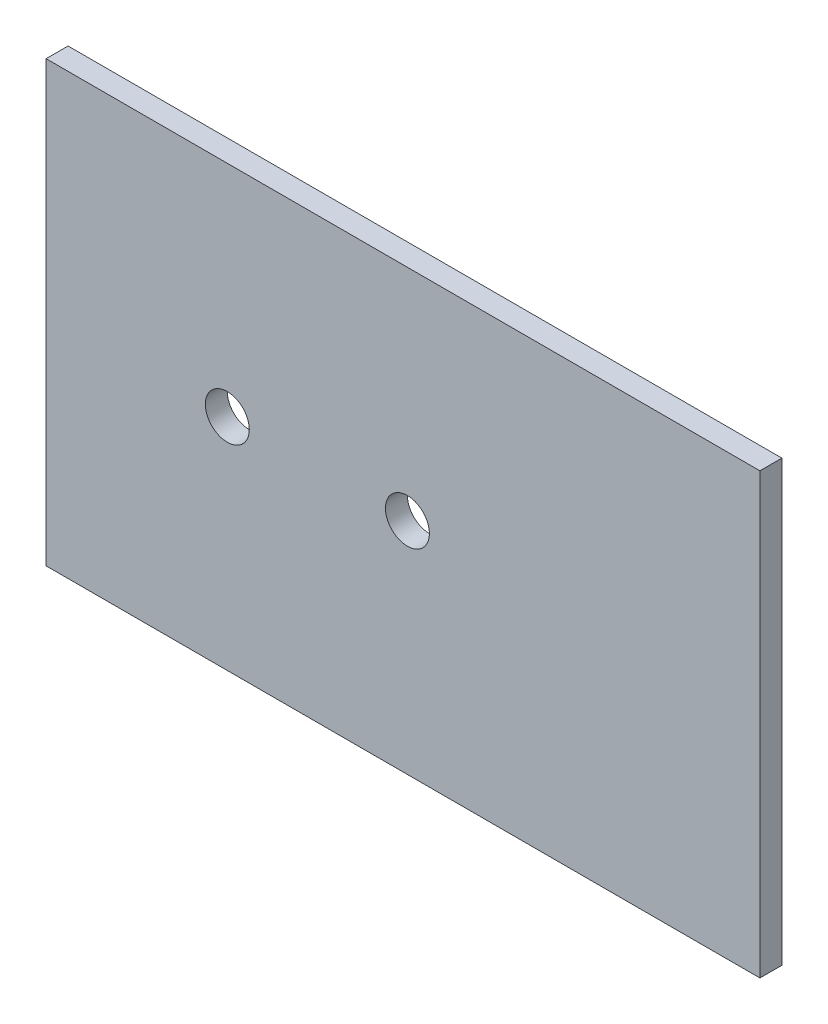
ISO-10303-21;
HEADER;
FILE_DESCRIPTION(('STEP AP214'),'2;1');
FILE_NAME('part.step','',(''),(''),'','','');
FILE_SCHEMA(('AUTOMOTIVE_DESIGN { 1 0 10303 214 1 1 1 1 }'));
ENDSEC;
DATA;
#1=APPLICATION_CONTEXT('core data for automotive mechanical design processes');
#2=APPLICATION_PROTOCOL_DEFINITION('international standard','automotive_design',2000,#1);
#3=PRODUCT_CONTEXT('',#1,'mechanical');
#4=PRODUCT('Part','Part','',(#3));
#5=PRODUCT_RELATED_PRODUCT_CATEGORY('part','',(#4));
#6=PRODUCT_DEFINITION_FORMATION('','',#4);
#7=PRODUCT_DEFINITION_CONTEXT('part definition',#1,'design');
#8=PRODUCT_DEFINITION('design','',#6,#7);
#9=PRODUCT_DEFINITION_SHAPE('','',#8);
#10=(LENGTH_UNIT() NAMED_UNIT(*) SI_UNIT(.MILLI.,.METRE.));
#11=(NAMED_UNIT(*) PLANE_ANGLE_UNIT() SI_UNIT($,.RADIAN.));
#12=(NAMED_UNIT(*) SI_UNIT($,.STERADIAN.) SOLID_ANGLE_UNIT());
#13=UNCERTAINTY_MEASURE_WITH_UNIT(LENGTH_MEASURE(1.E-05),#10,'distance_accuracy_value','');
#14=(GEOMETRIC_REPRESENTATION_CONTEXT(3) GLOBAL_UNCERTAINTY_ASSIGNED_CONTEXT((#13)) GLOBAL_UNIT_ASSIGNED_CONTEXT((#10,
#11,#12)) REPRESENTATION_CONTEXT('',''));
#15=CARTESIAN_POINT('',(0.,0.,0.));
#16=DIRECTION('',(0.,0.,1.));
#17=DIRECTION('',(1.,0.,0.));
#18=AXIS2_PLACEMENT_3D('',#15,#16,#17);
#19=CARTESIAN_POINT('',(-35.3818874597662,37.5093984962406,2.));
#20=DIRECTION('',(1.,0.,0.));
#21=DIRECTION('',(0.,1.,0.));
#22=AXIS2_PLACEMENT_3D('',#19,#20,#21);
#23=PLANE('',#22);
#24=DIRECTION('',(0.,-1.,0.));
#25=VECTOR('',#24,1.);
#26=CARTESIAN_POINT('',(-35.3818874597662,37.5093984962406,0.));
#27=LINE('',#26,#25);
#28=CARTESIAN_POINT('',(-35.3818874597662,37.5093984962406,0.));
#29=VERTEX_POINT('',#28);
#30=CARTESIAN_POINT('',(-35.3818874597662,-2.49060150375941,0.));
#31=VERTEX_POINT('',#30);
#32=EDGE_CURVE('E99',#29,#31,#27,.T.);
#33=ORIENTED_EDGE('',*,*,#32,.T.);
#34=DIRECTION('',(0.,0.,-1.));
#35=VECTOR('',#34,1.);
#36=CARTESIAN_POINT('',(-35.3818874597662,-2.49060150375941,2.));
#37=LINE('',#36,#35);
#38=CARTESIAN_POINT('',(-35.3818874597662,-2.49060150375941,2.));
#39=VERTEX_POINT('',#38);
#40=EDGE_CURVE('E11',#39,#31,#37,.T.);
#41=ORIENTED_EDGE('',*,*,#40,.F.);
#42=DIRECTION('',(0.,-1.,0.));
#43=VECTOR('',#42,1.);
#44=CARTESIAN_POINT('',(-35.3818874597662,37.5093984962406,2.));
#45=LINE('',#44,#43);
#46=CARTESIAN_POINT('',(-35.3818874597662,37.5093984962406,2.));
#47=VERTEX_POINT('',#46);
#48=EDGE_CURVE('E87',#47,#39,#45,.T.);
#49=ORIENTED_EDGE('',*,*,#48,.F.);
#50=DIRECTION('',(0.,0.,-1.));
#51=VECTOR('',#50,1.);
#52=CARTESIAN_POINT('',(-35.3818874597662,37.5093984962406,2.));
#53=LINE('',#52,#51);
#54=EDGE_CURVE('E95',#47,#29,#53,.T.);
#55=ORIENTED_EDGE('',*,*,#54,.T.);
#56=EDGE_LOOP('',(#33,#41,#49,#55));
#57=FACE_BOUND('',#56,.T.);
#58=ADVANCED_FACE('F36',(#57),#23,.F.);
#59=CARTESIAN_POINT('',(-35.3818874597662,-2.49060150375941,2.));
#60=DIRECTION('',(0.,1.,0.));
#61=DIRECTION('',(0.,0.,1.));
#62=AXIS2_PLACEMENT_3D('',#59,#60,#61);
#63=PLANE('',#62);
#64=DIRECTION('',(1.,0.,0.));
#65=VECTOR('',#64,1.);
#66=CARTESIAN_POINT('',(-35.3818874597662,-2.49060150375941,0.));
#67=LINE('',#66,#65);
#68=CARTESIAN_POINT('',(29.6181125402338,-2.49060150375941,0.));
#69=VERTEX_POINT('',#68);
#70=EDGE_CURVE('E91',#31,#69,#67,.T.);
#71=ORIENTED_EDGE('',*,*,#70,.T.);
#72=DIRECTION('',(0.,0.,-1.));
#73=VECTOR('',#72,1.);
#74=CARTESIAN_POINT('',(29.6181125402338,-2.49060150375941,2.));
#75=LINE('',#74,#73);
#76=CARTESIAN_POINT('',(29.6181125402338,-2.49060150375941,2.));
#77=VERTEX_POINT('',#76);
#78=EDGE_CURVE('E44',#77,#69,#75,.T.);
#79=ORIENTED_EDGE('',*,*,#78,.F.);
#80=DIRECTION('',(1.,0.,0.));
#81=VECTOR('',#80,1.);
#82=CARTESIAN_POINT('',(-35.3818874597662,-2.49060150375941,2.));
#83=LINE('',#82,#81);
#84=EDGE_CURVE('E82',#39,#77,#83,.T.);
#85=ORIENTED_EDGE('',*,*,#84,.F.);
#86=ORIENTED_EDGE('',*,*,#40,.T.);
#87=EDGE_LOOP('',(#71,#79,#85,#86));
#88=FACE_BOUND('',#87,.T.);
#89=ADVANCED_FACE('F90',(#88),#63,.F.);
#90=CARTESIAN_POINT('',(29.6181125402338,37.5093984962406,2.));
#91=DIRECTION('',(-1.,0.,0.));
#92=DIRECTION('',(0.,-1.,0.));
#93=AXIS2_PLACEMENT_3D('',#90,#91,#92);
#94=PLANE('',#93);
#95=DIRECTION('',(0.,1.,0.));
#96=VECTOR('',#95,1.);
#97=CARTESIAN_POINT('',(29.6181125402338,37.5093984962406,0.));
#98=LINE('',#97,#96);
#99=CARTESIAN_POINT('',(29.6181125402338,37.5093984962406,0.));
#100=VERTEX_POINT('',#99);
#101=EDGE_CURVE('E69',#69,#100,#98,.T.);
#102=ORIENTED_EDGE('',*,*,#101,.T.);
#103=DIRECTION('',(0.,0.,-1.));
#104=VECTOR('',#103,1.);
#105=CARTESIAN_POINT('',(29.6181125402338,37.5093984962406,2.));
#106=LINE('',#105,#104);
#107=CARTESIAN_POINT('',(29.6181125402338,37.5093984962406,2.));
#108=VERTEX_POINT('',#107);
#109=EDGE_CURVE('E92',#108,#100,#106,.T.);
#110=ORIENTED_EDGE('',*,*,#109,.F.);
#111=DIRECTION('',(0.,1.,0.));
#112=VECTOR('',#111,1.);
#113=CARTESIAN_POINT('',(29.6181125402338,37.5093984962406,2.));
#114=LINE('',#113,#112);
#115=EDGE_CURVE('E85',#77,#108,#114,.T.);
#116=ORIENTED_EDGE('',*,*,#115,.F.);
#117=ORIENTED_EDGE('',*,*,#78,.T.);
#118=EDGE_LOOP('',(#102,#110,#116,#117));
#119=FACE_BOUND('',#118,.T.);
#120=ADVANCED_FACE('F93',(#119),#94,.F.);
#121=CARTESIAN_POINT('',(-35.3818874597662,37.5093984962406,2.));
#122=DIRECTION('',(0.,-1.,0.));
#123=DIRECTION('',(0.,0.,-1.));
#124=AXIS2_PLACEMENT_3D('',#121,#122,#123);
#125=PLANE('',#124);
#126=DIRECTION('',(-1.,0.,0.));
#127=VECTOR('',#126,1.);
#128=CARTESIAN_POINT('',(-35.3818874597662,37.5093984962406,0.));
#129=LINE('',#128,#127);
#130=EDGE_CURVE('E75',#100,#29,#129,.T.);
#131=ORIENTED_EDGE('',*,*,#130,.T.);
#132=ORIENTED_EDGE('',*,*,#54,.F.);
#133=DIRECTION('',(-1.,0.,0.));
#134=VECTOR('',#133,1.);
#135=CARTESIAN_POINT('',(-35.3818874597662,37.5093984962406,2.));
#136=LINE('',#135,#134);
#137=EDGE_CURVE('E52',#108,#47,#136,.T.);
#138=ORIENTED_EDGE('',*,*,#137,.F.);
#139=ORIENTED_EDGE('',*,*,#109,.T.);
#140=EDGE_LOOP('',(#131,#132,#138,#139));
#141=FACE_BOUND('',#140,.T.);
#142=ADVANCED_FACE('F107',(#141),#125,.F.);
#143=CARTESIAN_POINT('',(0.,0.,2.));
#144=DIRECTION('',(0.,0.,1.));
#145=DIRECTION('',(1.,0.,0.));
#146=AXIS2_PLACEMENT_3D('',#143,#144,#145);
#147=PLANE('',#146);
#148=CARTESIAN_POINT('',(-18.8818874597662,17.5093984962406,2.));
#149=DIRECTION('',(0.,0.,1.));
#150=DIRECTION('',(1.,0.,0.));
#151=AXIS2_PLACEMENT_3D('',#148,#149,#150);
#152=CIRCLE('',#151,2.);
#153=CARTESIAN_POINT('',(-16.8818874597662,17.5093984962406,2.));
#154=VERTEX_POINT('',#153);
#155=EDGE_CURVE('E119',#154,#154,#152,.T.);
#156=ORIENTED_EDGE('',*,*,#155,.F.);
#157=EDGE_LOOP('',(#156));
#158=FACE_BOUND('',#157,.T.);
#159=CARTESIAN_POINT('',(-2.48188745976616,17.5093984962406,2.));
#160=DIRECTION('',(0.,0.,1.));
#161=DIRECTION('',(1.,0.,0.));
#162=AXIS2_PLACEMENT_3D('',#159,#160,#161);
#163=CIRCLE('',#162,2.);
#164=CARTESIAN_POINT('',(-0.481887459766163,17.5093984962406,2.));
#165=VERTEX_POINT('',#164);
#166=EDGE_CURVE('E113',#165,#165,#163,.T.);
#167=ORIENTED_EDGE('',*,*,#166,.F.);
#168=EDGE_LOOP('',(#167));
#169=FACE_BOUND('',#168,.T.);
#170=ORIENTED_EDGE('',*,*,#48,.T.);
#171=ORIENTED_EDGE('',*,*,#84,.T.);
#172=ORIENTED_EDGE('',*,*,#115,.T.);
#173=ORIENTED_EDGE('',*,*,#137,.T.);
#174=EDGE_LOOP('',(#170,#171,#172,#173));
#175=FACE_BOUND('',#174,.T.);
#176=ADVANCED_FACE('F83',(#158,#169,#175),#147,.T.);
#177=CARTESIAN_POINT('',(0.,0.,0.));
#178=DIRECTION('',(0.,0.,1.));
#179=DIRECTION('',(1.,0.,0.));
#180=AXIS2_PLACEMENT_3D('',#177,#178,#179);
#181=PLANE('',#180);
#182=CARTESIAN_POINT('',(-18.8818874597662,17.5093984962406,0.));
#183=DIRECTION('',(0.,0.,1.));
#184=DIRECTION('',(1.,0.,0.));
#185=AXIS2_PLACEMENT_3D('',#182,#183,#184);
#186=CIRCLE('',#185,2.);
#187=CARTESIAN_POINT('',(-16.8818874597662,17.5093984962406,0.));
#188=VERTEX_POINT('',#187);
#189=EDGE_CURVE('E102',#188,#188,#186,.T.);
#190=ORIENTED_EDGE('',*,*,#189,.T.);
#191=EDGE_LOOP('',(#190));
#192=FACE_BOUND('',#191,.T.);
#193=CARTESIAN_POINT('',(-2.48188745976616,17.5093984962406,0.));
#194=DIRECTION('',(0.,0.,1.));
#195=DIRECTION('',(1.,0.,0.));
#196=AXIS2_PLACEMENT_3D('',#193,#194,#195);
#197=CIRCLE('',#196,2.);
#198=CARTESIAN_POINT('',(-0.481887459766163,17.5093984962406,0.));
#199=VERTEX_POINT('',#198);
#200=EDGE_CURVE('E116',#199,#199,#197,.T.);
#201=ORIENTED_EDGE('',*,*,#200,.T.);
#202=EDGE_LOOP('',(#201));
#203=FACE_BOUND('',#202,.T.);
#204=ORIENTED_EDGE('',*,*,#32,.F.);
#205=ORIENTED_EDGE('',*,*,#130,.F.);
#206=ORIENTED_EDGE('',*,*,#101,.F.);
#207=ORIENTED_EDGE('',*,*,#70,.F.);
#208=EDGE_LOOP('',(#204,#205,#206,#207));
#209=FACE_BOUND('',#208,.T.);
#210=ADVANCED_FACE('F110',(#192,#203,#209),#181,.F.);
#211=CARTESIAN_POINT('',(-2.48188745976616,17.5093984962406,0.));
#212=DIRECTION('',(0.,0.,1.));
#213=DIRECTION('',(1.,0.,0.));
#214=AXIS2_PLACEMENT_3D('',#211,#212,#213);
#215=CYLINDRICAL_SURFACE('',#214,2.);
#216=ORIENTED_EDGE('',*,*,#200,.F.);
#217=EDGE_LOOP('',(#216));
#218=FACE_BOUND('',#217,.T.);
#219=ORIENTED_EDGE('',*,*,#166,.T.);
#220=EDGE_LOOP('',(#219));
#221=FACE_BOUND('',#220,.T.);
#222=ADVANCED_FACE('F130',(#218,#221),#215,.F.);
#223=CARTESIAN_POINT('',(-18.8818874597662,17.5093984962406,0.));
#224=DIRECTION('',(0.,0.,1.));
#225=DIRECTION('',(1.,0.,0.));
#226=AXIS2_PLACEMENT_3D('',#223,#224,#225);
#227=CYLINDRICAL_SURFACE('',#226,2.);
#228=ORIENTED_EDGE('',*,*,#189,.F.);
#229=EDGE_LOOP('',(#228));
#230=FACE_BOUND('',#229,.T.);
#231=ORIENTED_EDGE('',*,*,#155,.T.);
#232=EDGE_LOOP('',(#231));
#233=FACE_BOUND('',#232,.T.);
#234=ADVANCED_FACE('F127',(#230,#233),#227,.F.);
#235=CLOSED_SHELL('',(#58,#89,#120,#142,#176,#210,#222,#234));
#236=MANIFOLD_SOLID_BREP('B2',#235);
#237=ADVANCED_BREP_SHAPE_REPRESENTATION('',(#18,#236),#14);
#238=SHAPE_DEFINITION_REPRESENTATION(#9,#237);
ENDSEC;
END-ISO-10303-21;
